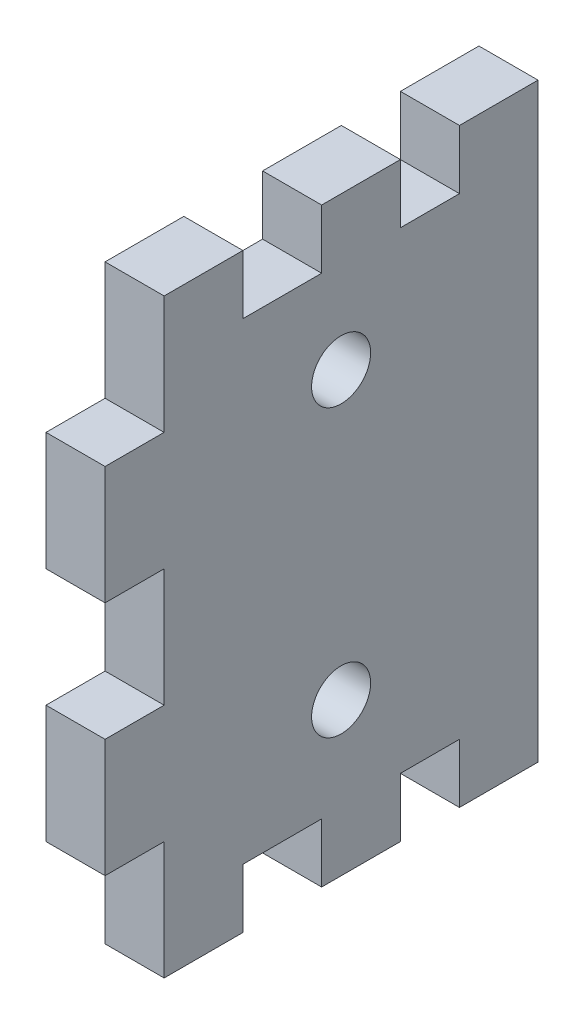
ISO-10303-21;
HEADER;
FILE_DESCRIPTION(('STEP AP214'),'2;1');
FILE_NAME('part.step','',(''),(''),'','','');
FILE_SCHEMA(('AUTOMOTIVE_DESIGN { 1 0 10303 214 1 1 1 1 }'));
ENDSEC;
DATA;
#1=APPLICATION_CONTEXT('core data for automotive mechanical design processes');
#2=APPLICATION_PROTOCOL_DEFINITION('international standard','automotive_design',2000,#1);
#3=PRODUCT_CONTEXT('',#1,'mechanical');
#4=PRODUCT('Part','Part','',(#3));
#5=PRODUCT_RELATED_PRODUCT_CATEGORY('part','',(#4));
#6=PRODUCT_DEFINITION_FORMATION('','',#4);
#7=PRODUCT_DEFINITION_CONTEXT('part definition',#1,'design');
#8=PRODUCT_DEFINITION('design','',#6,#7);
#9=PRODUCT_DEFINITION_SHAPE('','',#8);
#10=(LENGTH_UNIT() NAMED_UNIT(*) SI_UNIT(.MILLI.,.METRE.));
#11=(NAMED_UNIT(*) PLANE_ANGLE_UNIT() SI_UNIT($,.RADIAN.));
#12=(NAMED_UNIT(*) SI_UNIT($,.STERADIAN.) SOLID_ANGLE_UNIT());
#13=UNCERTAINTY_MEASURE_WITH_UNIT(LENGTH_MEASURE(1.E-05),#10,'distance_accuracy_value','');
#14=(GEOMETRIC_REPRESENTATION_CONTEXT(3) GLOBAL_UNCERTAINTY_ASSIGNED_CONTEXT((#13)) GLOBAL_UNIT_ASSIGNED_CONTEXT((#10,
#11,#12)) REPRESENTATION_CONTEXT('',''));
#15=CARTESIAN_POINT('',(0.,0.,0.));
#16=DIRECTION('',(0.,0.,1.));
#17=DIRECTION('',(1.,0.,0.));
#18=AXIS2_PLACEMENT_3D('',#15,#16,#17);
#19=CARTESIAN_POINT('',(3.,0.,0.));
#20=DIRECTION('',(-1.,0.,0.));
#21=DIRECTION('',(0.,0.,1.));
#22=AXIS2_PLACEMENT_3D('',#19,#20,#21);
#23=PLANE('',#22);
#24=DIRECTION('',(0.,0.,1.));
#25=VECTOR('',#24,1.);
#26=CARTESIAN_POINT('',(3.,0.822949720601509,0.));
#27=LINE('',#26,#25);
#28=CARTESIAN_POINT('',(3.,0.822949720601509,0.));
#29=VERTEX_POINT('',#28);
#30=CARTESIAN_POINT('',(3.,0.822949720601509,3.98854648936598));
#31=VERTEX_POINT('',#30);
#32=EDGE_CURVE('E305',#29,#31,#27,.T.);
#33=ORIENTED_EDGE('',*,*,#32,.T.);
#34=DIRECTION('',(0.,-1.,0.));
#35=VECTOR('',#34,1.);
#36=CARTESIAN_POINT('',(3.,-2.17705027939849,3.98854648936598));
#37=LINE('',#36,#35);
#38=CARTESIAN_POINT('',(3.,-2.17705027939849,3.98854648936598));
#39=VERTEX_POINT('',#38);
#40=EDGE_CURVE('E153',#31,#39,#37,.T.);
#41=ORIENTED_EDGE('',*,*,#40,.T.);
#42=DIRECTION('',(0.,0.,1.));
#43=VECTOR('',#42,1.);
#44=CARTESIAN_POINT('',(3.,-2.17705027939849,6.98854648936598));
#45=LINE('',#44,#43);
#46=CARTESIAN_POINT('',(3.,-2.17705027939849,6.98854648936598));
#47=VERTEX_POINT('',#46);
#48=EDGE_CURVE('E380',#39,#47,#45,.T.);
#49=ORIENTED_EDGE('',*,*,#48,.T.);
#50=DIRECTION('',(0.,1.,0.));
#51=VECTOR('',#50,1.);
#52=CARTESIAN_POINT('',(3.,0.822949720601506,6.98854648936598));
#53=LINE('',#52,#51);
#54=CARTESIAN_POINT('',(3.,0.822949720601506,6.98854648936598));
#55=VERTEX_POINT('',#54);
#56=EDGE_CURVE('E399',#47,#55,#53,.T.);
#57=ORIENTED_EDGE('',*,*,#56,.T.);
#58=DIRECTION('',(0.,0.,1.));
#59=VECTOR('',#58,1.);
#60=CARTESIAN_POINT('',(3.,0.822949720601506,10.988546489366));
#61=LINE('',#60,#59);
#62=CARTESIAN_POINT('',(3.,0.822949720601506,10.988546489366));
#63=VERTEX_POINT('',#62);
#64=EDGE_CURVE('E396',#55,#63,#61,.T.);
#65=ORIENTED_EDGE('',*,*,#64,.T.);
#66=DIRECTION('',(0.,-1.,0.));
#67=VECTOR('',#66,1.);
#68=CARTESIAN_POINT('',(3.,0.822949720601506,10.988546489366));
#69=LINE('',#68,#67);
#70=CARTESIAN_POINT('',(3.,-2.17705027939849,10.988546489366));
#71=VERTEX_POINT('',#70);
#72=EDGE_CURVE('E398',#63,#71,#69,.T.);
#73=ORIENTED_EDGE('',*,*,#72,.T.);
#74=DIRECTION('',(0.,0.,1.));
#75=VECTOR('',#74,1.);
#76=CARTESIAN_POINT('',(3.,-2.17705027939849,10.988546489366));
#77=LINE('',#76,#75);
#78=CARTESIAN_POINT('',(3.,-2.1770502793985,14.988546489366));
#79=VERTEX_POINT('',#78);
#80=EDGE_CURVE('E401',#71,#79,#77,.T.);
#81=ORIENTED_EDGE('',*,*,#80,.T.);
#82=DIRECTION('',(0.,1.,0.));
#83=VECTOR('',#82,1.);
#84=CARTESIAN_POINT('',(3.,-2.1770502793985,14.988546489366));
#85=LINE('',#84,#83);
#86=CARTESIAN_POINT('',(3.,0.822949720601505,14.988546489366));
#87=VERTEX_POINT('',#86);
#88=EDGE_CURVE('E407',#79,#87,#85,.T.);
#89=ORIENTED_EDGE('',*,*,#88,.T.);
#90=DIRECTION('',(0.,0.,1.));
#91=VECTOR('',#90,1.);
#92=CARTESIAN_POINT('',(3.,0.822949720601502,18.988546489366));
#93=LINE('',#92,#91);
#94=CARTESIAN_POINT('',(3.,0.822949720601502,18.988546489366));
#95=VERTEX_POINT('',#94);
#96=EDGE_CURVE('E409',#87,#95,#93,.T.);
#97=ORIENTED_EDGE('',*,*,#96,.T.);
#98=DIRECTION('',(0.,-1.,0.));
#99=VECTOR('',#98,1.);
#100=CARTESIAN_POINT('',(3.,-5.17705027939849,18.988546489366));
#101=LINE('',#100,#99);
#102=CARTESIAN_POINT('',(3.,-5.17705027939849,18.988546489366));
#103=VERTEX_POINT('',#102);
#104=EDGE_CURVE('E411',#95,#103,#101,.T.);
#105=ORIENTED_EDGE('',*,*,#104,.T.);
#106=DIRECTION('',(0.,0.,1.));
#107=VECTOR('',#106,1.);
#108=CARTESIAN_POINT('',(3.,-5.17705027939849,21.988546489366));
#109=LINE('',#108,#107);
#110=CARTESIAN_POINT('',(3.,-5.17705027939849,21.988546489366));
#111=VERTEX_POINT('',#110);
#112=EDGE_CURVE('E413',#103,#111,#109,.T.);
#113=ORIENTED_EDGE('',*,*,#112,.T.);
#114=DIRECTION('',(0.,-1.,0.));
#115=VECTOR('',#114,1.);
#116=CARTESIAN_POINT('',(3.,-11.1770502793985,21.988546489366));
#117=LINE('',#116,#115);
#118=CARTESIAN_POINT('',(3.,-11.1770502793985,21.988546489366));
#119=VERTEX_POINT('',#118);
#120=EDGE_CURVE('E415',#111,#119,#117,.T.);
#121=ORIENTED_EDGE('',*,*,#120,.T.);
#122=DIRECTION('',(0.,0.,-1.));
#123=VECTOR('',#122,1.);
#124=CARTESIAN_POINT('',(3.,-11.1770502793985,18.988546489366));
#125=LINE('',#124,#123);
#126=CARTESIAN_POINT('',(3.,-11.1770502793985,18.988546489366));
#127=VERTEX_POINT('',#126);
#128=EDGE_CURVE('E417',#119,#127,#125,.T.);
#129=ORIENTED_EDGE('',*,*,#128,.T.);
#130=DIRECTION('',(0.,-1.,0.));
#131=VECTOR('',#130,1.);
#132=CARTESIAN_POINT('',(3.,-17.1770502793985,18.988546489366));
#133=LINE('',#132,#131);
#134=CARTESIAN_POINT('',(3.,-17.1770502793985,18.988546489366));
#135=VERTEX_POINT('',#134);
#136=EDGE_CURVE('E419',#127,#135,#133,.T.);
#137=ORIENTED_EDGE('',*,*,#136,.T.);
#138=DIRECTION('',(0.,0.,1.));
#139=VECTOR('',#138,1.);
#140=CARTESIAN_POINT('',(3.,-17.1770502793985,21.988546489366));
#141=LINE('',#140,#139);
#142=CARTESIAN_POINT('',(3.,-17.1770502793985,21.988546489366));
#143=VERTEX_POINT('',#142);
#144=EDGE_CURVE('E421',#135,#143,#141,.T.);
#145=ORIENTED_EDGE('',*,*,#144,.T.);
#146=DIRECTION('',(0.,-1.,0.));
#147=VECTOR('',#146,1.);
#148=CARTESIAN_POINT('',(3.,-23.1770502793985,21.988546489366));
#149=LINE('',#148,#147);
#150=CARTESIAN_POINT('',(3.,-23.1770502793985,21.988546489366));
#151=VERTEX_POINT('',#150);
#152=EDGE_CURVE('E423',#143,#151,#149,.T.);
#153=ORIENTED_EDGE('',*,*,#152,.T.);
#154=DIRECTION('',(0.,0.,-1.));
#155=VECTOR('',#154,1.);
#156=CARTESIAN_POINT('',(3.,-23.1770502793985,18.988546489366));
#157=LINE('',#156,#155);
#158=CARTESIAN_POINT('',(3.,-23.1770502793985,18.988546489366));
#159=VERTEX_POINT('',#158);
#160=EDGE_CURVE('E425',#151,#159,#157,.T.);
#161=ORIENTED_EDGE('',*,*,#160,.T.);
#162=DIRECTION('',(0.,-1.,0.));
#163=VECTOR('',#162,1.);
#164=CARTESIAN_POINT('',(3.,-29.1770502793985,18.988546489366));
#165=LINE('',#164,#163);
#166=CARTESIAN_POINT('',(3.,-29.1770502793985,18.988546489366));
#167=VERTEX_POINT('',#166);
#168=EDGE_CURVE('E427',#159,#167,#165,.T.);
#169=ORIENTED_EDGE('',*,*,#168,.T.);
#170=DIRECTION('',(0.,0.,-1.));
#171=VECTOR('',#170,1.);
#172=CARTESIAN_POINT('',(3.,-29.1770502793985,18.988546489366));
#173=LINE('',#172,#171);
#174=CARTESIAN_POINT('',(3.,-29.1770502793985,14.988546489366));
#175=VERTEX_POINT('',#174);
#176=EDGE_CURVE('E429',#167,#175,#173,.T.);
#177=ORIENTED_EDGE('',*,*,#176,.T.);
#178=DIRECTION('',(0.,1.,0.));
#179=VECTOR('',#178,1.);
#180=CARTESIAN_POINT('',(3.,-26.1770502793985,14.988546489366));
#181=LINE('',#180,#179);
#182=CARTESIAN_POINT('',(3.,-26.1770502793985,14.988546489366));
#183=VERTEX_POINT('',#182);
#184=EDGE_CURVE('E431',#175,#183,#181,.T.);
#185=ORIENTED_EDGE('',*,*,#184,.T.);
#186=DIRECTION('',(0.,0.,-1.));
#187=VECTOR('',#186,1.);
#188=CARTESIAN_POINT('',(3.,-26.1770502793985,10.988546489366));
#189=LINE('',#188,#187);
#190=CARTESIAN_POINT('',(3.,-26.1770502793985,10.988546489366));
#191=VERTEX_POINT('',#190);
#192=EDGE_CURVE('E433',#183,#191,#189,.T.);
#193=ORIENTED_EDGE('',*,*,#192,.T.);
#194=DIRECTION('',(0.,-1.,0.));
#195=VECTOR('',#194,1.);
#196=CARTESIAN_POINT('',(3.,-29.1770502793985,10.988546489366));
#197=LINE('',#196,#195);
#198=CARTESIAN_POINT('',(3.,-29.1770502793985,10.988546489366));
#199=VERTEX_POINT('',#198);
#200=EDGE_CURVE('E435',#191,#199,#197,.T.);
#201=ORIENTED_EDGE('',*,*,#200,.T.);
#202=DIRECTION('',(0.,0.,-1.));
#203=VECTOR('',#202,1.);
#204=CARTESIAN_POINT('',(3.,-29.1770502793985,10.988546489366));
#205=LINE('',#204,#203);
#206=CARTESIAN_POINT('',(3.,-29.1770502793985,6.98854648936598));
#207=VERTEX_POINT('',#206);
#208=EDGE_CURVE('E437',#199,#207,#205,.T.);
#209=ORIENTED_EDGE('',*,*,#208,.T.);
#210=DIRECTION('',(0.,1.,0.));
#211=VECTOR('',#210,1.);
#212=CARTESIAN_POINT('',(3.,-29.1770502793985,6.98854648936598));
#213=LINE('',#212,#211);
#214=CARTESIAN_POINT('',(3.,-26.1770502793985,6.98854648936598));
#215=VERTEX_POINT('',#214);
#216=EDGE_CURVE('E439',#207,#215,#213,.T.);
#217=ORIENTED_EDGE('',*,*,#216,.T.);
#218=DIRECTION('',(0.,0.,-1.));
#219=VECTOR('',#218,1.);
#220=CARTESIAN_POINT('',(3.,-26.1770502793985,6.98854648936598));
#221=LINE('',#220,#219);
#222=CARTESIAN_POINT('',(3.,-26.1770502793985,3.98854648936598));
#223=VERTEX_POINT('',#222);
#224=EDGE_CURVE('E232',#215,#223,#221,.T.);
#225=ORIENTED_EDGE('',*,*,#224,.T.);
#226=DIRECTION('',(0.,-1.,0.));
#227=VECTOR('',#226,1.);
#228=CARTESIAN_POINT('',(3.,-26.1770502793985,3.98854648936598));
#229=LINE('',#228,#227);
#230=CARTESIAN_POINT('',(3.,-29.1770502793985,3.98854648936598));
#231=VERTEX_POINT('',#230);
#232=EDGE_CURVE('E226',#223,#231,#229,.T.);
#233=ORIENTED_EDGE('',*,*,#232,.T.);
#234=DIRECTION('',(0.,0.,-1.));
#235=VECTOR('',#234,1.);
#236=CARTESIAN_POINT('',(3.,-29.1770502793985,0.));
#237=LINE('',#236,#235);
#238=CARTESIAN_POINT('',(3.,-29.1770502793985,0.));
#239=VERTEX_POINT('',#238);
#240=EDGE_CURVE('E230',#231,#239,#237,.T.);
#241=ORIENTED_EDGE('',*,*,#240,.T.);
#242=DIRECTION('',(0.,1.,0.));
#243=VECTOR('',#242,1.);
#244=CARTESIAN_POINT('',(3.,-29.1770502793985,0.));
#245=LINE('',#244,#243);
#246=EDGE_CURVE('E50',#239,#29,#245,.T.);
#247=ORIENTED_EDGE('',*,*,#246,.T.);
#248=EDGE_LOOP('',(#33,#41,#49,#57,#65,#73,#81,#89,#97,#105,#113,#121,#129,#137,#145,#153,#161,
#169,#177,#185,#193,#201,#209,#217,#225,#233,#241,#247));
#249=FACE_BOUND('',#248,.T.);
#250=CARTESIAN_POINT('',(3.,-6.91705027939849,10.));
#251=DIRECTION('',(1.,0.,0.));
#252=DIRECTION('',(0.,0.,-1.));
#253=AXIS2_PLACEMENT_3D('',#250,#251,#252);
#254=CIRCLE('',#253,1.5);
#255=CARTESIAN_POINT('',(3.,-6.91705027939849,8.5));
#256=VERTEX_POINT('',#255);
#257=EDGE_CURVE('E254',#256,#256,#254,.T.);
#258=ORIENTED_EDGE('',*,*,#257,.F.);
#259=EDGE_LOOP('',(#258));
#260=FACE_BOUND('',#259,.T.);
#261=CARTESIAN_POINT('',(3.,-21.4370502793985,10.));
#262=DIRECTION('',(1.,0.,0.));
#263=DIRECTION('',(0.,0.,1.));
#264=AXIS2_PLACEMENT_3D('',#261,#262,#263);
#265=CIRCLE('',#264,1.5);
#266=CARTESIAN_POINT('',(3.,-21.4370502793985,11.5));
#267=VERTEX_POINT('',#266);
#268=EDGE_CURVE('E480',#267,#267,#265,.T.);
#269=ORIENTED_EDGE('',*,*,#268,.F.);
#270=EDGE_LOOP('',(#269));
#271=FACE_BOUND('',#270,.T.);
#272=ADVANCED_FACE('F33',(#249,#260,#271),#23,.F.);
#273=CARTESIAN_POINT('',(0.,0.,0.));
#274=DIRECTION('',(-1.,0.,0.));
#275=DIRECTION('',(0.,0.,1.));
#276=AXIS2_PLACEMENT_3D('',#273,#274,#275);
#277=PLANE('',#276);
#278=CARTESIAN_POINT('',(0.,-6.91705027939849,10.));
#279=DIRECTION('',(1.,0.,0.));
#280=DIRECTION('',(0.,0.,-1.));
#281=AXIS2_PLACEMENT_3D('',#278,#279,#280);
#282=CIRCLE('',#281,1.5);
#283=CARTESIAN_POINT('',(0.,-6.91705027939849,8.5));
#284=VERTEX_POINT('',#283);
#285=EDGE_CURVE('E485',#284,#284,#282,.T.);
#286=ORIENTED_EDGE('',*,*,#285,.T.);
#287=EDGE_LOOP('',(#286));
#288=FACE_BOUND('',#287,.T.);
#289=DIRECTION('',(0.,0.,1.));
#290=VECTOR('',#289,1.);
#291=CARTESIAN_POINT('',(0.,0.822949720601509,0.));
#292=LINE('',#291,#290);
#293=CARTESIAN_POINT('',(0.,0.822949720601509,0.));
#294=VERTEX_POINT('',#293);
#295=CARTESIAN_POINT('',(0.,0.822949720601509,3.98854648936598));
#296=VERTEX_POINT('',#295);
#297=EDGE_CURVE('E250',#294,#296,#292,.T.);
#298=ORIENTED_EDGE('',*,*,#297,.F.);
#299=DIRECTION('',(0.,1.,0.));
#300=VECTOR('',#299,1.);
#301=CARTESIAN_POINT('',(0.,-29.1770502793985,0.));
#302=LINE('',#301,#300);
#303=CARTESIAN_POINT('',(0.,-29.1770502793985,0.));
#304=VERTEX_POINT('',#303);
#305=EDGE_CURVE('E145',#304,#294,#302,.T.);
#306=ORIENTED_EDGE('',*,*,#305,.F.);
#307=DIRECTION('',(0.,0.,-1.));
#308=VECTOR('',#307,1.);
#309=CARTESIAN_POINT('',(0.,-29.1770502793985,0.));
#310=LINE('',#309,#308);
#311=CARTESIAN_POINT('',(0.,-29.1770502793985,3.98854648936598));
#312=VERTEX_POINT('',#311);
#313=EDGE_CURVE('E139',#312,#304,#310,.T.);
#314=ORIENTED_EDGE('',*,*,#313,.F.);
#315=DIRECTION('',(0.,-1.,0.));
#316=VECTOR('',#315,1.);
#317=CARTESIAN_POINT('',(0.,-26.1770502793985,3.98854648936598));
#318=LINE('',#317,#316);
#319=CARTESIAN_POINT('',(0.,-26.1770502793985,3.98854648936598));
#320=VERTEX_POINT('',#319);
#321=EDGE_CURVE('E240',#320,#312,#318,.T.);
#322=ORIENTED_EDGE('',*,*,#321,.F.);
#323=DIRECTION('',(0.,0.,-1.));
#324=VECTOR('',#323,1.);
#325=CARTESIAN_POINT('',(0.,-26.1770502793985,6.98854648936598));
#326=LINE('',#325,#324);
#327=CARTESIAN_POINT('',(0.,-26.1770502793985,6.98854648936598));
#328=VERTEX_POINT('',#327);
#329=EDGE_CURVE('E300',#328,#320,#326,.T.);
#330=ORIENTED_EDGE('',*,*,#329,.F.);
#331=DIRECTION('',(0.,1.,0.));
#332=VECTOR('',#331,1.);
#333=CARTESIAN_POINT('',(0.,-29.1770502793985,6.98854648936598));
#334=LINE('',#333,#332);
#335=CARTESIAN_POINT('',(0.,-29.1770502793985,6.98854648936598));
#336=VERTEX_POINT('',#335);
#337=EDGE_CURVE('E298',#336,#328,#334,.T.);
#338=ORIENTED_EDGE('',*,*,#337,.F.);
#339=DIRECTION('',(0.,0.,-1.));
#340=VECTOR('',#339,1.);
#341=CARTESIAN_POINT('',(0.,-29.1770502793985,10.988546489366));
#342=LINE('',#341,#340);
#343=CARTESIAN_POINT('',(0.,-29.1770502793985,10.988546489366));
#344=VERTEX_POINT('',#343);
#345=EDGE_CURVE('E296',#344,#336,#342,.T.);
#346=ORIENTED_EDGE('',*,*,#345,.F.);
#347=DIRECTION('',(0.,-1.,0.));
#348=VECTOR('',#347,1.);
#349=CARTESIAN_POINT('',(0.,-29.1770502793985,10.988546489366));
#350=LINE('',#349,#348);
#351=CARTESIAN_POINT('',(0.,-26.1770502793985,10.988546489366));
#352=VERTEX_POINT('',#351);
#353=EDGE_CURVE('E294',#352,#344,#350,.T.);
#354=ORIENTED_EDGE('',*,*,#353,.F.);
#355=DIRECTION('',(0.,0.,-1.));
#356=VECTOR('',#355,1.);
#357=CARTESIAN_POINT('',(0.,-26.1770502793985,10.988546489366));
#358=LINE('',#357,#356);
#359=CARTESIAN_POINT('',(0.,-26.1770502793985,14.988546489366));
#360=VERTEX_POINT('',#359);
#361=EDGE_CURVE('E292',#360,#352,#358,.T.);
#362=ORIENTED_EDGE('',*,*,#361,.F.);
#363=DIRECTION('',(0.,1.,0.));
#364=VECTOR('',#363,1.);
#365=CARTESIAN_POINT('',(0.,-26.1770502793985,14.988546489366));
#366=LINE('',#365,#364);
#367=CARTESIAN_POINT('',(0.,-29.1770502793985,14.988546489366));
#368=VERTEX_POINT('',#367);
#369=EDGE_CURVE('E290',#368,#360,#366,.T.);
#370=ORIENTED_EDGE('',*,*,#369,.F.);
#371=DIRECTION('',(0.,0.,-1.));
#372=VECTOR('',#371,1.);
#373=CARTESIAN_POINT('',(0.,-29.1770502793985,18.988546489366));
#374=LINE('',#373,#372);
#375=CARTESIAN_POINT('',(0.,-29.1770502793985,18.988546489366));
#376=VERTEX_POINT('',#375);
#377=EDGE_CURVE('E288',#376,#368,#374,.T.);
#378=ORIENTED_EDGE('',*,*,#377,.F.);
#379=DIRECTION('',(0.,-1.,0.));
#380=VECTOR('',#379,1.);
#381=CARTESIAN_POINT('',(0.,-29.1770502793985,18.988546489366));
#382=LINE('',#381,#380);
#383=CARTESIAN_POINT('',(0.,-23.1770502793985,18.988546489366));
#384=VERTEX_POINT('',#383);
#385=EDGE_CURVE('E286',#384,#376,#382,.T.);
#386=ORIENTED_EDGE('',*,*,#385,.F.);
#387=DIRECTION('',(0.,0.,-1.));
#388=VECTOR('',#387,1.);
#389=CARTESIAN_POINT('',(0.,-23.1770502793985,18.988546489366));
#390=LINE('',#389,#388);
#391=CARTESIAN_POINT('',(0.,-23.1770502793985,21.988546489366));
#392=VERTEX_POINT('',#391);
#393=EDGE_CURVE('E284',#392,#384,#390,.T.);
#394=ORIENTED_EDGE('',*,*,#393,.F.);
#395=DIRECTION('',(0.,-1.,0.));
#396=VECTOR('',#395,1.);
#397=CARTESIAN_POINT('',(0.,-23.1770502793985,21.988546489366));
#398=LINE('',#397,#396);
#399=CARTESIAN_POINT('',(0.,-17.1770502793985,21.988546489366));
#400=VERTEX_POINT('',#399);
#401=EDGE_CURVE('E282',#400,#392,#398,.T.);
#402=ORIENTED_EDGE('',*,*,#401,.F.);
#403=DIRECTION('',(0.,0.,1.));
#404=VECTOR('',#403,1.);
#405=CARTESIAN_POINT('',(0.,-17.1770502793985,21.988546489366));
#406=LINE('',#405,#404);
#407=CARTESIAN_POINT('',(0.,-17.1770502793985,18.988546489366));
#408=VERTEX_POINT('',#407);
#409=EDGE_CURVE('E280',#408,#400,#406,.T.);
#410=ORIENTED_EDGE('',*,*,#409,.F.);
#411=DIRECTION('',(0.,-1.,0.));
#412=VECTOR('',#411,1.);
#413=CARTESIAN_POINT('',(0.,-17.1770502793985,18.988546489366));
#414=LINE('',#413,#412);
#415=CARTESIAN_POINT('',(0.,-11.1770502793985,18.988546489366));
#416=VERTEX_POINT('',#415);
#417=EDGE_CURVE('E278',#416,#408,#414,.T.);
#418=ORIENTED_EDGE('',*,*,#417,.F.);
#419=DIRECTION('',(0.,0.,-1.));
#420=VECTOR('',#419,1.);
#421=CARTESIAN_POINT('',(0.,-11.1770502793985,18.988546489366));
#422=LINE('',#421,#420);
#423=CARTESIAN_POINT('',(0.,-11.1770502793985,21.988546489366));
#424=VERTEX_POINT('',#423);
#425=EDGE_CURVE('E276',#424,#416,#422,.T.);
#426=ORIENTED_EDGE('',*,*,#425,.F.);
#427=DIRECTION('',(0.,-1.,0.));
#428=VECTOR('',#427,1.);
#429=CARTESIAN_POINT('',(0.,-11.1770502793985,21.988546489366));
#430=LINE('',#429,#428);
#431=CARTESIAN_POINT('',(0.,-5.17705027939849,21.988546489366));
#432=VERTEX_POINT('',#431);
#433=EDGE_CURVE('E274',#432,#424,#430,.T.);
#434=ORIENTED_EDGE('',*,*,#433,.F.);
#435=DIRECTION('',(0.,0.,1.));
#436=VECTOR('',#435,1.);
#437=CARTESIAN_POINT('',(0.,-5.17705027939849,21.988546489366));
#438=LINE('',#437,#436);
#439=CARTESIAN_POINT('',(0.,-5.17705027939849,18.988546489366));
#440=VERTEX_POINT('',#439);
#441=EDGE_CURVE('E272',#440,#432,#438,.T.);
#442=ORIENTED_EDGE('',*,*,#441,.F.);
#443=DIRECTION('',(0.,-1.,0.));
#444=VECTOR('',#443,1.);
#445=CARTESIAN_POINT('',(0.,-5.17705027939849,18.988546489366));
#446=LINE('',#445,#444);
#447=CARTESIAN_POINT('',(0.,0.822949720601502,18.988546489366));
#448=VERTEX_POINT('',#447);
#449=EDGE_CURVE('E270',#448,#440,#446,.T.);
#450=ORIENTED_EDGE('',*,*,#449,.F.);
#451=DIRECTION('',(0.,0.,1.));
#452=VECTOR('',#451,1.);
#453=CARTESIAN_POINT('',(0.,0.822949720601502,18.988546489366));
#454=LINE('',#453,#452);
#455=CARTESIAN_POINT('',(0.,0.822949720601505,14.988546489366));
#456=VERTEX_POINT('',#455);
#457=EDGE_CURVE('E268',#456,#448,#454,.T.);
#458=ORIENTED_EDGE('',*,*,#457,.F.);
#459=DIRECTION('',(0.,1.,0.));
#460=VECTOR('',#459,1.);
#461=CARTESIAN_POINT('',(0.,-2.1770502793985,14.988546489366));
#462=LINE('',#461,#460);
#463=CARTESIAN_POINT('',(0.,-2.1770502793985,14.988546489366));
#464=VERTEX_POINT('',#463);
#465=EDGE_CURVE('E266',#464,#456,#462,.T.);
#466=ORIENTED_EDGE('',*,*,#465,.F.);
#467=DIRECTION('',(0.,0.,1.));
#468=VECTOR('',#467,1.);
#469=CARTESIAN_POINT('',(0.,-2.17705027939849,10.988546489366));
#470=LINE('',#469,#468);
#471=CARTESIAN_POINT('',(0.,-2.17705027939849,10.988546489366));
#472=VERTEX_POINT('',#471);
#473=EDGE_CURVE('E264',#472,#464,#470,.T.);
#474=ORIENTED_EDGE('',*,*,#473,.F.);
#475=DIRECTION('',(0.,-1.,0.));
#476=VECTOR('',#475,1.);
#477=CARTESIAN_POINT('',(0.,0.822949720601506,10.988546489366));
#478=LINE('',#477,#476);
#479=CARTESIAN_POINT('',(0.,0.822949720601506,10.988546489366));
#480=VERTEX_POINT('',#479);
#481=EDGE_CURVE('E262',#480,#472,#478,.T.);
#482=ORIENTED_EDGE('',*,*,#481,.F.);
#483=DIRECTION('',(0.,0.,1.));
#484=VECTOR('',#483,1.);
#485=CARTESIAN_POINT('',(0.,0.822949720601506,10.988546489366));
#486=LINE('',#485,#484);
#487=CARTESIAN_POINT('',(0.,0.822949720601506,6.98854648936598));
#488=VERTEX_POINT('',#487);
#489=EDGE_CURVE('E260',#488,#480,#486,.T.);
#490=ORIENTED_EDGE('',*,*,#489,.F.);
#491=DIRECTION('',(0.,1.,0.));
#492=VECTOR('',#491,1.);
#493=CARTESIAN_POINT('',(0.,0.822949720601506,6.98854648936598));
#494=LINE('',#493,#492);
#495=CARTESIAN_POINT('',(0.,-2.17705027939849,6.98854648936598));
#496=VERTEX_POINT('',#495);
#497=EDGE_CURVE('E258',#496,#488,#494,.T.);
#498=ORIENTED_EDGE('',*,*,#497,.F.);
#499=DIRECTION('',(0.,0.,1.));
#500=VECTOR('',#499,1.);
#501=CARTESIAN_POINT('',(0.,-2.17705027939849,6.98854648936598));
#502=LINE('',#501,#500);
#503=CARTESIAN_POINT('',(0.,-2.17705027939849,3.98854648936598));
#504=VERTEX_POINT('',#503);
#505=EDGE_CURVE('E256',#504,#496,#502,.T.);
#506=ORIENTED_EDGE('',*,*,#505,.F.);
#507=DIRECTION('',(0.,-1.,0.));
#508=VECTOR('',#507,1.);
#509=CARTESIAN_POINT('',(0.,-2.17705027939849,3.98854648936598));
#510=LINE('',#509,#508);
#511=EDGE_CURVE('E253',#296,#504,#510,.T.);
#512=ORIENTED_EDGE('',*,*,#511,.F.);
#513=EDGE_LOOP('',(#298,#306,#314,#322,#330,#338,#346,#354,#362,#370,#378,#386,#394,#402,#410,
#418,#426,#434,#442,#450,#458,#466,#474,#482,#490,#498,#506,#512));
#514=FACE_BOUND('',#513,.T.);
#515=CARTESIAN_POINT('',(0.,-21.4370502793985,10.));
#516=DIRECTION('',(1.,0.,0.));
#517=DIRECTION('',(0.,0.,1.));
#518=AXIS2_PLACEMENT_3D('',#515,#516,#517);
#519=CIRCLE('',#518,1.5);
#520=CARTESIAN_POINT('',(0.,-21.4370502793985,11.5));
#521=VERTEX_POINT('',#520);
#522=EDGE_CURVE('E483',#521,#521,#519,.T.);
#523=ORIENTED_EDGE('',*,*,#522,.T.);
#524=EDGE_LOOP('',(#523));
#525=FACE_BOUND('',#524,.T.);
#526=ADVANCED_FACE('F384',(#288,#514,#525),#277,.T.);
#527=CARTESIAN_POINT('',(3.,0.822949720601509,0.));
#528=DIRECTION('',(0.,-1.,0.));
#529=DIRECTION('',(0.,0.,-1.));
#530=AXIS2_PLACEMENT_3D('',#527,#528,#529);
#531=PLANE('',#530);
#532=ORIENTED_EDGE('',*,*,#297,.T.);
#533=DIRECTION('',(-1.,0.,0.));
#534=VECTOR('',#533,1.);
#535=CARTESIAN_POINT('',(3.,0.822949720601509,3.98854648936598));
#536=LINE('',#535,#534);
#537=EDGE_CURVE('E11',#31,#296,#536,.T.);
#538=ORIENTED_EDGE('',*,*,#537,.F.);
#539=ORIENTED_EDGE('',*,*,#32,.F.);
#540=DIRECTION('',(-1.,0.,0.));
#541=VECTOR('',#540,1.);
#542=CARTESIAN_POINT('',(3.,0.822949720601509,0.));
#543=LINE('',#542,#541);
#544=EDGE_CURVE('E246',#29,#294,#543,.T.);
#545=ORIENTED_EDGE('',*,*,#544,.T.);
#546=EDGE_LOOP('',(#532,#538,#539,#545));
#547=FACE_BOUND('',#546,.T.);
#548=ADVANCED_FACE('F35',(#547),#531,.F.);
#549=CARTESIAN_POINT('',(3.,-2.17705027939849,3.98854648936598));
#550=DIRECTION('',(0.,0.,-1.));
#551=DIRECTION('',(0.,1.,0.));
#552=AXIS2_PLACEMENT_3D('',#549,#550,#551);
#553=PLANE('',#552);
#554=ORIENTED_EDGE('',*,*,#511,.T.);
#555=DIRECTION('',(-1.,0.,0.));
#556=VECTOR('',#555,1.);
#557=CARTESIAN_POINT('',(3.,-2.17705027939849,3.98854648936598));
#558=LINE('',#557,#556);
#559=EDGE_CURVE('E42',#39,#504,#558,.T.);
#560=ORIENTED_EDGE('',*,*,#559,.F.);
#561=ORIENTED_EDGE('',*,*,#40,.F.);
#562=ORIENTED_EDGE('',*,*,#537,.T.);
#563=EDGE_LOOP('',(#554,#560,#561,#562));
#564=FACE_BOUND('',#563,.T.);
#565=ADVANCED_FACE('F740',(#564),#553,.F.);
#566=CARTESIAN_POINT('',(3.,-2.17705027939849,6.98854648936598));
#567=DIRECTION('',(0.,-1.,0.));
#568=DIRECTION('',(0.,0.,-1.));
#569=AXIS2_PLACEMENT_3D('',#566,#567,#568);
#570=PLANE('',#569);
#571=ORIENTED_EDGE('',*,*,#505,.T.);
#572=DIRECTION('',(-1.,0.,0.));
#573=VECTOR('',#572,1.);
#574=CARTESIAN_POINT('',(3.,-2.17705027939849,6.98854648936598));
#575=LINE('',#574,#573);
#576=EDGE_CURVE('E372',#47,#496,#575,.T.);
#577=ORIENTED_EDGE('',*,*,#576,.F.);
#578=ORIENTED_EDGE('',*,*,#48,.F.);
#579=ORIENTED_EDGE('',*,*,#559,.T.);
#580=EDGE_LOOP('',(#571,#577,#578,#579));
#581=FACE_BOUND('',#580,.T.);
#582=ADVANCED_FACE('F378',(#581),#570,.F.);
#583=CARTESIAN_POINT('',(3.,0.822949720601506,6.98854648936598));
#584=DIRECTION('',(0.,0.,1.));
#585=DIRECTION('',(0.,-1.,0.));
#586=AXIS2_PLACEMENT_3D('',#583,#584,#585);
#587=PLANE('',#586);
#588=ORIENTED_EDGE('',*,*,#497,.T.);
#589=DIRECTION('',(-1.,0.,0.));
#590=VECTOR('',#589,1.);
#591=CARTESIAN_POINT('',(3.,0.822949720601506,6.98854648936598));
#592=LINE('',#591,#590);
#593=EDGE_CURVE('E369',#55,#488,#592,.T.);
#594=ORIENTED_EDGE('',*,*,#593,.F.);
#595=ORIENTED_EDGE('',*,*,#56,.F.);
#596=ORIENTED_EDGE('',*,*,#576,.T.);
#597=EDGE_LOOP('',(#588,#594,#595,#596));
#598=FACE_BOUND('',#597,.T.);
#599=ADVANCED_FACE('F390',(#598),#587,.F.);
#600=CARTESIAN_POINT('',(3.,0.822949720601506,10.988546489366));
#601=DIRECTION('',(0.,-1.,0.));
#602=DIRECTION('',(0.,0.,-1.));
#603=AXIS2_PLACEMENT_3D('',#600,#601,#602);
#604=PLANE('',#603);
#605=ORIENTED_EDGE('',*,*,#489,.T.);
#606=DIRECTION('',(-1.,0.,0.));
#607=VECTOR('',#606,1.);
#608=CARTESIAN_POINT('',(3.,0.822949720601506,10.988546489366));
#609=LINE('',#608,#607);
#610=EDGE_CURVE('E366',#63,#480,#609,.T.);
#611=ORIENTED_EDGE('',*,*,#610,.F.);
#612=ORIENTED_EDGE('',*,*,#64,.F.);
#613=ORIENTED_EDGE('',*,*,#593,.T.);
#614=EDGE_LOOP('',(#605,#611,#612,#613));
#615=FACE_BOUND('',#614,.T.);
#616=ADVANCED_FACE('F394',(#615),#604,.F.);
#617=CARTESIAN_POINT('',(3.,0.822949720601506,10.988546489366));
#618=DIRECTION('',(0.,0.,-1.));
#619=DIRECTION('',(-1.,0.,0.));
#620=AXIS2_PLACEMENT_3D('',#617,#618,#619);
#621=PLANE('',#620);
#622=ORIENTED_EDGE('',*,*,#481,.T.);
#623=DIRECTION('',(-1.,0.,0.));
#624=VECTOR('',#623,1.);
#625=CARTESIAN_POINT('',(3.,-2.17705027939849,10.988546489366));
#626=LINE('',#625,#624);
#627=EDGE_CURVE('E363',#71,#472,#626,.T.);
#628=ORIENTED_EDGE('',*,*,#627,.F.);
#629=ORIENTED_EDGE('',*,*,#72,.F.);
#630=ORIENTED_EDGE('',*,*,#610,.T.);
#631=EDGE_LOOP('',(#622,#628,#629,#630));
#632=FACE_BOUND('',#631,.T.);
#633=ADVANCED_FACE('F705',(#632),#621,.F.);
#634=CARTESIAN_POINT('',(3.,-2.17705027939849,10.988546489366));
#635=DIRECTION('',(0.,-1.,0.));
#636=DIRECTION('',(0.,0.,-1.));
#637=AXIS2_PLACEMENT_3D('',#634,#635,#636);
#638=PLANE('',#637);
#639=ORIENTED_EDGE('',*,*,#473,.T.);
#640=DIRECTION('',(-1.,0.,0.));
#641=VECTOR('',#640,1.);
#642=CARTESIAN_POINT('',(3.,-2.1770502793985,14.988546489366));
#643=LINE('',#642,#641);
#644=EDGE_CURVE('E360',#79,#464,#643,.T.);
#645=ORIENTED_EDGE('',*,*,#644,.F.);
#646=ORIENTED_EDGE('',*,*,#80,.F.);
#647=ORIENTED_EDGE('',*,*,#627,.T.);
#648=EDGE_LOOP('',(#639,#645,#646,#647));
#649=FACE_BOUND('',#648,.T.);
#650=ADVANCED_FACE('F695',(#649),#638,.F.);
#651=CARTESIAN_POINT('',(3.,-2.1770502793985,14.988546489366));
#652=DIRECTION('',(0.,0.,1.));
#653=DIRECTION('',(0.,-1.,0.));
#654=AXIS2_PLACEMENT_3D('',#651,#652,#653);
#655=PLANE('',#654);
#656=ORIENTED_EDGE('',*,*,#465,.T.);
#657=DIRECTION('',(-1.,0.,0.));
#658=VECTOR('',#657,1.);
#659=CARTESIAN_POINT('',(3.,0.822949720601505,14.988546489366));
#660=LINE('',#659,#658);
#661=EDGE_CURVE('E357',#87,#456,#660,.T.);
#662=ORIENTED_EDGE('',*,*,#661,.F.);
#663=ORIENTED_EDGE('',*,*,#88,.F.);
#664=ORIENTED_EDGE('',*,*,#644,.T.);
#665=EDGE_LOOP('',(#656,#662,#663,#664));
#666=FACE_BOUND('',#665,.T.);
#667=ADVANCED_FACE('F685',(#666),#655,.F.);
#668=CARTESIAN_POINT('',(3.,0.822949720601502,18.988546489366));
#669=DIRECTION('',(0.,-1.,0.));
#670=DIRECTION('',(0.,0.,-1.));
#671=AXIS2_PLACEMENT_3D('',#668,#669,#670);
#672=PLANE('',#671);
#673=ORIENTED_EDGE('',*,*,#457,.T.);
#674=DIRECTION('',(-1.,0.,0.));
#675=VECTOR('',#674,1.);
#676=CARTESIAN_POINT('',(3.,0.822949720601502,18.988546489366));
#677=LINE('',#676,#675);
#678=EDGE_CURVE('E354',#95,#448,#677,.T.);
#679=ORIENTED_EDGE('',*,*,#678,.F.);
#680=ORIENTED_EDGE('',*,*,#96,.F.);
#681=ORIENTED_EDGE('',*,*,#661,.T.);
#682=EDGE_LOOP('',(#673,#679,#680,#681));
#683=FACE_BOUND('',#682,.T.);
#684=ADVANCED_FACE('F675',(#683),#672,.F.);
#685=CARTESIAN_POINT('',(3.,-5.17705027939849,18.988546489366));
#686=DIRECTION('',(0.,0.,-1.));
#687=DIRECTION('',(-1.,0.,0.));
#688=AXIS2_PLACEMENT_3D('',#685,#686,#687);
#689=PLANE('',#688);
#690=ORIENTED_EDGE('',*,*,#449,.T.);
#691=DIRECTION('',(-1.,0.,0.));
#692=VECTOR('',#691,1.);
#693=CARTESIAN_POINT('',(3.,-5.17705027939849,18.988546489366));
#694=LINE('',#693,#692);
#695=EDGE_CURVE('E351',#103,#440,#694,.T.);
#696=ORIENTED_EDGE('',*,*,#695,.F.);
#697=ORIENTED_EDGE('',*,*,#104,.F.);
#698=ORIENTED_EDGE('',*,*,#678,.T.);
#699=EDGE_LOOP('',(#690,#696,#697,#698));
#700=FACE_BOUND('',#699,.T.);
#701=ADVANCED_FACE('F665',(#700),#689,.F.);
#702=CARTESIAN_POINT('',(3.,-5.17705027939849,21.988546489366));
#703=DIRECTION('',(0.,-1.,0.));
#704=DIRECTION('',(0.,0.,-1.));
#705=AXIS2_PLACEMENT_3D('',#702,#703,#704);
#706=PLANE('',#705);
#707=ORIENTED_EDGE('',*,*,#441,.T.);
#708=DIRECTION('',(-1.,0.,0.));
#709=VECTOR('',#708,1.);
#710=CARTESIAN_POINT('',(3.,-5.17705027939849,21.988546489366));
#711=LINE('',#710,#709);
#712=EDGE_CURVE('E348',#111,#432,#711,.T.);
#713=ORIENTED_EDGE('',*,*,#712,.F.);
#714=ORIENTED_EDGE('',*,*,#112,.F.);
#715=ORIENTED_EDGE('',*,*,#695,.T.);
#716=EDGE_LOOP('',(#707,#713,#714,#715));
#717=FACE_BOUND('',#716,.T.);
#718=ADVANCED_FACE('F655',(#717),#706,.F.);
#719=CARTESIAN_POINT('',(3.,-11.1770502793985,21.988546489366));
#720=DIRECTION('',(0.,0.,-1.));
#721=DIRECTION('',(-1.,0.,0.));
#722=AXIS2_PLACEMENT_3D('',#719,#720,#721);
#723=PLANE('',#722);
#724=ORIENTED_EDGE('',*,*,#433,.T.);
#725=DIRECTION('',(-1.,0.,0.));
#726=VECTOR('',#725,1.);
#727=CARTESIAN_POINT('',(3.,-11.1770502793985,21.988546489366));
#728=LINE('',#727,#726);
#729=EDGE_CURVE('E345',#119,#424,#728,.T.);
#730=ORIENTED_EDGE('',*,*,#729,.F.);
#731=ORIENTED_EDGE('',*,*,#120,.F.);
#732=ORIENTED_EDGE('',*,*,#712,.T.);
#733=EDGE_LOOP('',(#724,#730,#731,#732));
#734=FACE_BOUND('',#733,.T.);
#735=ADVANCED_FACE('F645',(#734),#723,.F.);
#736=CARTESIAN_POINT('',(3.,-11.1770502793985,18.988546489366));
#737=DIRECTION('',(0.,1.,0.));
#738=DIRECTION('',(0.,0.,1.));
#739=AXIS2_PLACEMENT_3D('',#736,#737,#738);
#740=PLANE('',#739);
#741=ORIENTED_EDGE('',*,*,#425,.T.);
#742=DIRECTION('',(-1.,0.,0.));
#743=VECTOR('',#742,1.);
#744=CARTESIAN_POINT('',(3.,-11.1770502793985,18.988546489366));
#745=LINE('',#744,#743);
#746=EDGE_CURVE('E342',#127,#416,#745,.T.);
#747=ORIENTED_EDGE('',*,*,#746,.F.);
#748=ORIENTED_EDGE('',*,*,#128,.F.);
#749=ORIENTED_EDGE('',*,*,#729,.T.);
#750=EDGE_LOOP('',(#741,#747,#748,#749));
#751=FACE_BOUND('',#750,.T.);
#752=ADVANCED_FACE('F635',(#751),#740,.F.);
#753=CARTESIAN_POINT('',(3.,-17.1770502793985,18.988546489366));
#754=DIRECTION('',(0.,0.,-1.));
#755=DIRECTION('',(0.,1.,0.));
#756=AXIS2_PLACEMENT_3D('',#753,#754,#755);
#757=PLANE('',#756);
#758=ORIENTED_EDGE('',*,*,#417,.T.);
#759=DIRECTION('',(-1.,0.,0.));
#760=VECTOR('',#759,1.);
#761=CARTESIAN_POINT('',(3.,-17.1770502793985,18.988546489366));
#762=LINE('',#761,#760);
#763=EDGE_CURVE('E339',#135,#408,#762,.T.);
#764=ORIENTED_EDGE('',*,*,#763,.F.);
#765=ORIENTED_EDGE('',*,*,#136,.F.);
#766=ORIENTED_EDGE('',*,*,#746,.T.);
#767=EDGE_LOOP('',(#758,#764,#765,#766));
#768=FACE_BOUND('',#767,.T.);
#769=ADVANCED_FACE('F625',(#768),#757,.F.);
#770=CARTESIAN_POINT('',(3.,-17.1770502793985,21.988546489366));
#771=DIRECTION('',(0.,-1.,0.));
#772=DIRECTION('',(0.,0.,-1.));
#773=AXIS2_PLACEMENT_3D('',#770,#771,#772);
#774=PLANE('',#773);
#775=ORIENTED_EDGE('',*,*,#409,.T.);
#776=DIRECTION('',(-1.,0.,0.));
#777=VECTOR('',#776,1.);
#778=CARTESIAN_POINT('',(3.,-17.1770502793985,21.988546489366));
#779=LINE('',#778,#777);
#780=EDGE_CURVE('E336',#143,#400,#779,.T.);
#781=ORIENTED_EDGE('',*,*,#780,.F.);
#782=ORIENTED_EDGE('',*,*,#144,.F.);
#783=ORIENTED_EDGE('',*,*,#763,.T.);
#784=EDGE_LOOP('',(#775,#781,#782,#783));
#785=FACE_BOUND('',#784,.T.);
#786=ADVANCED_FACE('F615',(#785),#774,.F.);
#787=CARTESIAN_POINT('',(3.,-23.1770502793985,21.988546489366));
#788=DIRECTION('',(0.,0.,-1.));
#789=DIRECTION('',(-1.,0.,0.));
#790=AXIS2_PLACEMENT_3D('',#787,#788,#789);
#791=PLANE('',#790);
#792=ORIENTED_EDGE('',*,*,#401,.T.);
#793=DIRECTION('',(-1.,0.,0.));
#794=VECTOR('',#793,1.);
#795=CARTESIAN_POINT('',(3.,-23.1770502793985,21.988546489366));
#796=LINE('',#795,#794);
#797=EDGE_CURVE('E333',#151,#392,#796,.T.);
#798=ORIENTED_EDGE('',*,*,#797,.F.);
#799=ORIENTED_EDGE('',*,*,#152,.F.);
#800=ORIENTED_EDGE('',*,*,#780,.T.);
#801=EDGE_LOOP('',(#792,#798,#799,#800));
#802=FACE_BOUND('',#801,.T.);
#803=ADVANCED_FACE('F605',(#802),#791,.F.);
#804=CARTESIAN_POINT('',(3.,-23.1770502793985,18.988546489366));
#805=DIRECTION('',(0.,1.,0.));
#806=DIRECTION('',(0.,0.,1.));
#807=AXIS2_PLACEMENT_3D('',#804,#805,#806);
#808=PLANE('',#807);
#809=ORIENTED_EDGE('',*,*,#393,.T.);
#810=DIRECTION('',(-1.,0.,0.));
#811=VECTOR('',#810,1.);
#812=CARTESIAN_POINT('',(3.,-23.1770502793985,18.988546489366));
#813=LINE('',#812,#811);
#814=EDGE_CURVE('E330',#159,#384,#813,.T.);
#815=ORIENTED_EDGE('',*,*,#814,.F.);
#816=ORIENTED_EDGE('',*,*,#160,.F.);
#817=ORIENTED_EDGE('',*,*,#797,.T.);
#818=EDGE_LOOP('',(#809,#815,#816,#817));
#819=FACE_BOUND('',#818,.T.);
#820=ADVANCED_FACE('F595',(#819),#808,.F.);
#821=CARTESIAN_POINT('',(3.,-29.1770502793985,18.988546489366));
#822=DIRECTION('',(0.,0.,-1.));
#823=DIRECTION('',(0.,1.,0.));
#824=AXIS2_PLACEMENT_3D('',#821,#822,#823);
#825=PLANE('',#824);
#826=ORIENTED_EDGE('',*,*,#385,.T.);
#827=DIRECTION('',(-1.,0.,0.));
#828=VECTOR('',#827,1.);
#829=CARTESIAN_POINT('',(3.,-29.1770502793985,18.988546489366));
#830=LINE('',#829,#828);
#831=EDGE_CURVE('E327',#167,#376,#830,.T.);
#832=ORIENTED_EDGE('',*,*,#831,.F.);
#833=ORIENTED_EDGE('',*,*,#168,.F.);
#834=ORIENTED_EDGE('',*,*,#814,.T.);
#835=EDGE_LOOP('',(#826,#832,#833,#834));
#836=FACE_BOUND('',#835,.T.);
#837=ADVANCED_FACE('F585',(#836),#825,.F.);
#838=CARTESIAN_POINT('',(3.,-29.1770502793985,18.988546489366));
#839=DIRECTION('',(0.,1.,0.));
#840=DIRECTION('',(0.,0.,1.));
#841=AXIS2_PLACEMENT_3D('',#838,#839,#840);
#842=PLANE('',#841);
#843=ORIENTED_EDGE('',*,*,#377,.T.);
#844=DIRECTION('',(-1.,0.,0.));
#845=VECTOR('',#844,1.);
#846=CARTESIAN_POINT('',(3.,-29.1770502793985,14.988546489366));
#847=LINE('',#846,#845);
#848=EDGE_CURVE('E324',#175,#368,#847,.T.);
#849=ORIENTED_EDGE('',*,*,#848,.F.);
#850=ORIENTED_EDGE('',*,*,#176,.F.);
#851=ORIENTED_EDGE('',*,*,#831,.T.);
#852=EDGE_LOOP('',(#843,#849,#850,#851));
#853=FACE_BOUND('',#852,.T.);
#854=ADVANCED_FACE('F575',(#853),#842,.F.);
#855=CARTESIAN_POINT('',(3.,-26.1770502793985,14.988546489366));
#856=DIRECTION('',(0.,0.,1.));
#857=DIRECTION('',(0.,-1.,0.));
#858=AXIS2_PLACEMENT_3D('',#855,#856,#857);
#859=PLANE('',#858);
#860=ORIENTED_EDGE('',*,*,#369,.T.);
#861=DIRECTION('',(-1.,0.,0.));
#862=VECTOR('',#861,1.);
#863=CARTESIAN_POINT('',(3.,-26.1770502793985,14.988546489366));
#864=LINE('',#863,#862);
#865=EDGE_CURVE('E321',#183,#360,#864,.T.);
#866=ORIENTED_EDGE('',*,*,#865,.F.);
#867=ORIENTED_EDGE('',*,*,#184,.F.);
#868=ORIENTED_EDGE('',*,*,#848,.T.);
#869=EDGE_LOOP('',(#860,#866,#867,#868));
#870=FACE_BOUND('',#869,.T.);
#871=ADVANCED_FACE('F565',(#870),#859,.F.);
#872=CARTESIAN_POINT('',(3.,-26.1770502793985,10.988546489366));
#873=DIRECTION('',(0.,1.,0.));
#874=DIRECTION('',(0.,0.,1.));
#875=AXIS2_PLACEMENT_3D('',#872,#873,#874);
#876=PLANE('',#875);
#877=ORIENTED_EDGE('',*,*,#361,.T.);
#878=DIRECTION('',(-1.,0.,0.));
#879=VECTOR('',#878,1.);
#880=CARTESIAN_POINT('',(3.,-26.1770502793985,10.988546489366));
#881=LINE('',#880,#879);
#882=EDGE_CURVE('E318',#191,#352,#881,.T.);
#883=ORIENTED_EDGE('',*,*,#882,.F.);
#884=ORIENTED_EDGE('',*,*,#192,.F.);
#885=ORIENTED_EDGE('',*,*,#865,.T.);
#886=EDGE_LOOP('',(#877,#883,#884,#885));
#887=FACE_BOUND('',#886,.T.);
#888=ADVANCED_FACE('F555',(#887),#876,.F.);
#889=CARTESIAN_POINT('',(3.,-29.1770502793985,10.988546489366));
#890=DIRECTION('',(0.,0.,-1.));
#891=DIRECTION('',(0.,1.,0.));
#892=AXIS2_PLACEMENT_3D('',#889,#890,#891);
#893=PLANE('',#892);
#894=ORIENTED_EDGE('',*,*,#353,.T.);
#895=DIRECTION('',(-1.,0.,0.));
#896=VECTOR('',#895,1.);
#897=CARTESIAN_POINT('',(3.,-29.1770502793985,10.988546489366));
#898=LINE('',#897,#896);
#899=EDGE_CURVE('E315',#199,#344,#898,.T.);
#900=ORIENTED_EDGE('',*,*,#899,.F.);
#901=ORIENTED_EDGE('',*,*,#200,.F.);
#902=ORIENTED_EDGE('',*,*,#882,.T.);
#903=EDGE_LOOP('',(#894,#900,#901,#902));
#904=FACE_BOUND('',#903,.T.);
#905=ADVANCED_FACE('F545',(#904),#893,.F.);
#906=CARTESIAN_POINT('',(3.,-29.1770502793985,10.988546489366));
#907=DIRECTION('',(0.,1.,0.));
#908=DIRECTION('',(0.,0.,1.));
#909=AXIS2_PLACEMENT_3D('',#906,#907,#908);
#910=PLANE('',#909);
#911=ORIENTED_EDGE('',*,*,#345,.T.);
#912=DIRECTION('',(-1.,0.,0.));
#913=VECTOR('',#912,1.);
#914=CARTESIAN_POINT('',(3.,-29.1770502793985,6.98854648936598));
#915=LINE('',#914,#913);
#916=EDGE_CURVE('E312',#207,#336,#915,.T.);
#917=ORIENTED_EDGE('',*,*,#916,.F.);
#918=ORIENTED_EDGE('',*,*,#208,.F.);
#919=ORIENTED_EDGE('',*,*,#899,.T.);
#920=EDGE_LOOP('',(#911,#917,#918,#919));
#921=FACE_BOUND('',#920,.T.);
#922=ADVANCED_FACE('F536',(#921),#910,.F.);
#923=CARTESIAN_POINT('',(3.,-29.1770502793985,6.98854648936598));
#924=DIRECTION('',(0.,0.,1.));
#925=DIRECTION('',(1.,0.,0.));
#926=AXIS2_PLACEMENT_3D('',#923,#924,#925);
#927=PLANE('',#926);
#928=ORIENTED_EDGE('',*,*,#337,.T.);
#929=DIRECTION('',(-1.,0.,0.));
#930=VECTOR('',#929,1.);
#931=CARTESIAN_POINT('',(3.,-26.1770502793985,6.98854648936598));
#932=LINE('',#931,#930);
#933=EDGE_CURVE('E309',#215,#328,#932,.T.);
#934=ORIENTED_EDGE('',*,*,#933,.F.);
#935=ORIENTED_EDGE('',*,*,#216,.F.);
#936=ORIENTED_EDGE('',*,*,#916,.T.);
#937=EDGE_LOOP('',(#928,#934,#935,#936));
#938=FACE_BOUND('',#937,.T.);
#939=ADVANCED_FACE('F445',(#938),#927,.F.);
#940=CARTESIAN_POINT('',(3.,-26.1770502793985,6.98854648936598));
#941=DIRECTION('',(0.,1.,0.));
#942=DIRECTION('',(0.,0.,1.));
#943=AXIS2_PLACEMENT_3D('',#940,#941,#942);
#944=PLANE('',#943);
#945=ORIENTED_EDGE('',*,*,#329,.T.);
#946=DIRECTION('',(-1.,0.,0.));
#947=VECTOR('',#946,1.);
#948=CARTESIAN_POINT('',(3.,-26.1770502793985,3.98854648936598));
#949=LINE('',#948,#947);
#950=EDGE_CURVE('E241',#223,#320,#949,.T.);
#951=ORIENTED_EDGE('',*,*,#950,.F.);
#952=ORIENTED_EDGE('',*,*,#224,.F.);
#953=ORIENTED_EDGE('',*,*,#933,.T.);
#954=EDGE_LOOP('',(#945,#951,#952,#953));
#955=FACE_BOUND('',#954,.T.);
#956=ADVANCED_FACE('F449',(#955),#944,.F.);
#957=CARTESIAN_POINT('',(3.,-26.1770502793985,3.98854648936598));
#958=DIRECTION('',(0.,0.,-1.));
#959=DIRECTION('',(-1.,0.,0.));
#960=AXIS2_PLACEMENT_3D('',#957,#958,#959);
#961=PLANE('',#960);
#962=ORIENTED_EDGE('',*,*,#321,.T.);
#963=DIRECTION('',(-1.,0.,0.));
#964=VECTOR('',#963,1.);
#965=CARTESIAN_POINT('',(3.,-29.1770502793985,3.98854648936598));
#966=LINE('',#965,#964);
#967=EDGE_CURVE('E237',#231,#312,#966,.T.);
#968=ORIENTED_EDGE('',*,*,#967,.F.);
#969=ORIENTED_EDGE('',*,*,#232,.F.);
#970=ORIENTED_EDGE('',*,*,#950,.T.);
#971=EDGE_LOOP('',(#962,#968,#969,#970));
#972=FACE_BOUND('',#971,.T.);
#973=ADVANCED_FACE('F238',(#972),#961,.F.);
#974=CARTESIAN_POINT('',(3.,-29.1770502793985,0.));
#975=DIRECTION('',(0.,1.,0.));
#976=DIRECTION('',(0.,0.,1.));
#977=AXIS2_PLACEMENT_3D('',#974,#975,#976);
#978=PLANE('',#977);
#979=ORIENTED_EDGE('',*,*,#313,.T.);
#980=DIRECTION('',(-1.,0.,0.));
#981=VECTOR('',#980,1.);
#982=CARTESIAN_POINT('',(3.,-29.1770502793985,0.));
#983=LINE('',#982,#981);
#984=EDGE_CURVE('E242',#239,#304,#983,.T.);
#985=ORIENTED_EDGE('',*,*,#984,.F.);
#986=ORIENTED_EDGE('',*,*,#240,.F.);
#987=ORIENTED_EDGE('',*,*,#967,.T.);
#988=EDGE_LOOP('',(#979,#985,#986,#987));
#989=FACE_BOUND('',#988,.T.);
#990=ADVANCED_FACE('F244',(#989),#978,.F.);
#991=CARTESIAN_POINT('',(3.,-29.1770502793985,0.));
#992=DIRECTION('',(0.,0.,1.));
#993=DIRECTION('',(0.,-1.,0.));
#994=AXIS2_PLACEMENT_3D('',#991,#992,#993);
#995=PLANE('',#994);
#996=ORIENTED_EDGE('',*,*,#305,.T.);
#997=ORIENTED_EDGE('',*,*,#544,.F.);
#998=ORIENTED_EDGE('',*,*,#246,.F.);
#999=ORIENTED_EDGE('',*,*,#984,.T.);
#1000=EDGE_LOOP('',(#996,#997,#998,#999));
#1001=FACE_BOUND('',#1000,.T.);
#1002=ADVANCED_FACE('F453',(#1001),#995,.F.);
#1003=CARTESIAN_POINT('',(3.,-6.91705027939849,10.));
#1004=DIRECTION('',(-1.,0.,0.));
#1005=DIRECTION('',(0.,0.,1.));
#1006=AXIS2_PLACEMENT_3D('',#1003,#1004,#1005);
#1007=CYLINDRICAL_SURFACE('',#1006,1.5);
#1008=ORIENTED_EDGE('',*,*,#257,.T.);
#1009=EDGE_LOOP('',(#1008));
#1010=FACE_BOUND('',#1009,.T.);
#1011=ORIENTED_EDGE('',*,*,#285,.F.);
#1012=EDGE_LOOP('',(#1011));
#1013=FACE_BOUND('',#1012,.T.);
#1014=ADVANCED_FACE('F455',(#1010,#1013),#1007,.F.);
#1015=CARTESIAN_POINT('',(3.,-21.4370502793985,10.));
#1016=DIRECTION('',(-1.,0.,0.));
#1017=DIRECTION('',(0.,0.,1.));
#1018=AXIS2_PLACEMENT_3D('',#1015,#1016,#1017);
#1019=CYLINDRICAL_SURFACE('',#1018,1.5);
#1020=ORIENTED_EDGE('',*,*,#268,.T.);
#1021=EDGE_LOOP('',(#1020));
#1022=FACE_BOUND('',#1021,.T.);
#1023=ORIENTED_EDGE('',*,*,#522,.F.);
#1024=EDGE_LOOP('',(#1023));
#1025=FACE_BOUND('',#1024,.T.);
#1026=ADVANCED_FACE('F461',(#1022,#1025),#1019,.F.);
#1027=CLOSED_SHELL('',(#272,#526,#548,#565,#582,#599,#616,#633,#650,#667,#684,#701,#718,#735,
#752,#769,#786,#803,#820,#837,#854,#871,#888,#905,#922,#939,#956,#973,#990,#1002,#1014,#1026));
#1028=MANIFOLD_SOLID_BREP('B2',#1027);
#1029=ADVANCED_BREP_SHAPE_REPRESENTATION('',(#18,#1028),#14);
#1030=SHAPE_DEFINITION_REPRESENTATION(#9,#1029);
ENDSEC;
END-ISO-10303-21;
